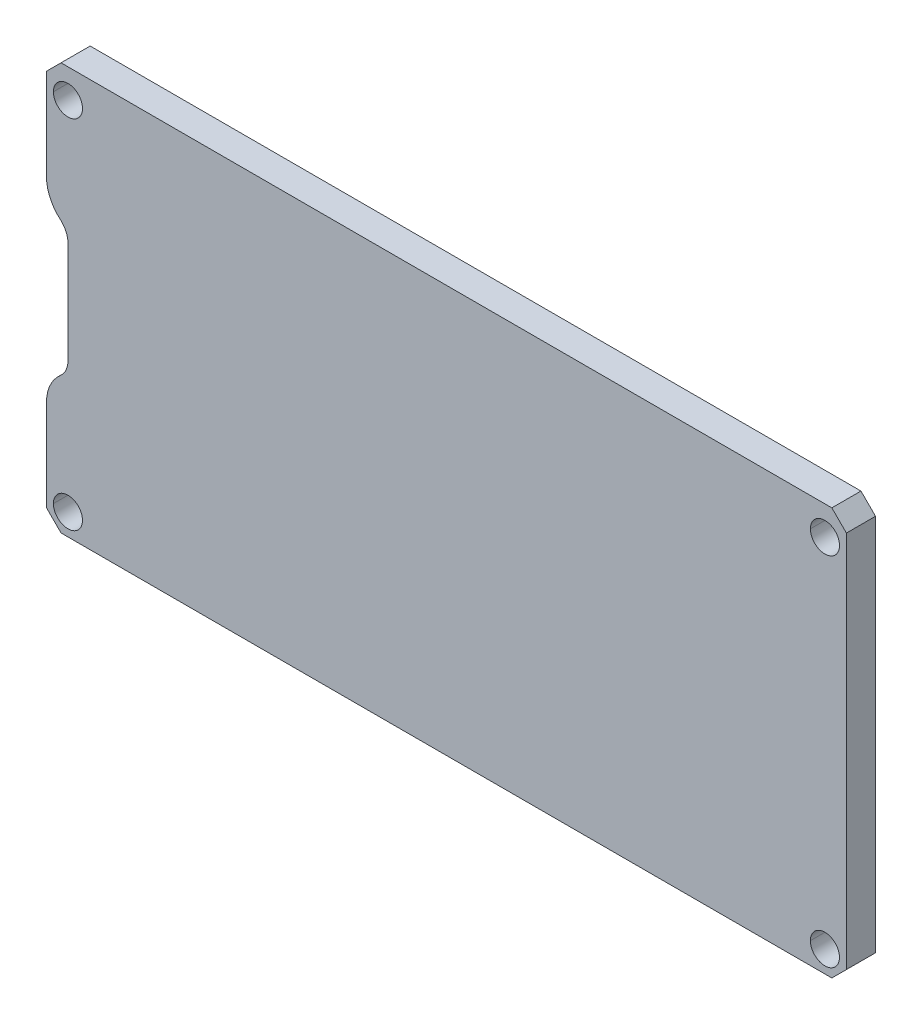
ISO-10303-21;
HEADER;
FILE_DESCRIPTION(('STEP AP214'),'2;1');
FILE_NAME('part.step','',(''),(''),'','','');
FILE_SCHEMA(('AUTOMOTIVE_DESIGN { 1 0 10303 214 1 1 1 1 }'));
ENDSEC;
DATA;
#1=APPLICATION_CONTEXT('core data for automotive mechanical design processes');
#2=APPLICATION_PROTOCOL_DEFINITION('international standard','automotive_design',2000,#1);
#3=PRODUCT_CONTEXT('',#1,'mechanical');
#4=PRODUCT('Part','Part','',(#3));
#5=PRODUCT_RELATED_PRODUCT_CATEGORY('part','',(#4));
#6=PRODUCT_DEFINITION_FORMATION('','',#4);
#7=PRODUCT_DEFINITION_CONTEXT('part definition',#1,'design');
#8=PRODUCT_DEFINITION('design','',#6,#7);
#9=PRODUCT_DEFINITION_SHAPE('','',#8);
#10=(LENGTH_UNIT() NAMED_UNIT(*) SI_UNIT(.MILLI.,.METRE.));
#11=(NAMED_UNIT(*) PLANE_ANGLE_UNIT() SI_UNIT($,.RADIAN.));
#12=(NAMED_UNIT(*) SI_UNIT($,.STERADIAN.) SOLID_ANGLE_UNIT());
#13=UNCERTAINTY_MEASURE_WITH_UNIT(LENGTH_MEASURE(1.E-05),#10,'distance_accuracy_value','');
#14=(GEOMETRIC_REPRESENTATION_CONTEXT(3) GLOBAL_UNCERTAINTY_ASSIGNED_CONTEXT((#13)) GLOBAL_UNIT_ASSIGNED_CONTEXT((#10,
#11,#12)) REPRESENTATION_CONTEXT('',''));
#15=CARTESIAN_POINT('',(0.,0.,0.));
#16=DIRECTION('',(0.,0.,1.));
#17=DIRECTION('',(1.,0.,0.));
#18=AXIS2_PLACEMENT_3D('',#15,#16,#17);
#19=CARTESIAN_POINT('',(26.0000003874302,12.0000001788139,0.));
#20=DIRECTION('',(0.,0.,1.));
#21=DIRECTION('',(1.,0.,0.));
#22=AXIS2_PLACEMENT_3D('',#19,#20,#21);
#23=CYLINDRICAL_SURFACE('',#22,1.00000001490116);
#24=DIRECTION('',(0.,0.,1.));
#25=VECTOR('',#24,1.);
#26=CARTESIAN_POINT('',(25.000000372529,12.0000001788139,0.));
#27=LINE('',#26,#25);
#28=CARTESIAN_POINT('',(25.000000372529,12.0000001788139,0.));
#29=VERTEX_POINT('',#28);
#30=CARTESIAN_POINT('',(25.000000372529,12.0000001788139,2.));
#31=VERTEX_POINT('',#30);
#32=EDGE_CURVE('E296',#29,#31,#27,.T.);
#33=ORIENTED_EDGE('',*,*,#32,.F.);
#34=CARTESIAN_POINT('',(26.0000003874302,12.0000001788139,0.));
#35=DIRECTION('',(0.,0.,-1.));
#36=DIRECTION('',(1.,0.,0.));
#37=AXIS2_PLACEMENT_3D('',#34,#35,#36);
#38=CIRCLE('',#37,1.00000001490116);
#39=CARTESIAN_POINT('',(27.0000004023314,12.0000001788139,0.));
#40=VERTEX_POINT('',#39);
#41=EDGE_CURVE('E388',#29,#40,#38,.T.);
#42=ORIENTED_EDGE('',*,*,#41,.T.);
#43=DIRECTION('',(0.,0.,1.));
#44=VECTOR('',#43,1.);
#45=CARTESIAN_POINT('',(27.0000004023314,12.0000001788139,0.));
#46=LINE('',#45,#44);
#47=CARTESIAN_POINT('',(27.0000004023314,12.0000001788139,2.));
#48=VERTEX_POINT('',#47);
#49=EDGE_CURVE('E295',#40,#48,#46,.T.);
#50=ORIENTED_EDGE('',*,*,#49,.T.);
#51=CARTESIAN_POINT('',(26.0000003874302,12.0000001788139,2.));
#52=DIRECTION('',(0.,0.,-1.));
#53=DIRECTION('',(1.,0.,0.));
#54=AXIS2_PLACEMENT_3D('',#51,#52,#53);
#55=CIRCLE('',#54,1.00000001490116);
#56=EDGE_CURVE('E318',#31,#48,#55,.T.);
#57=ORIENTED_EDGE('',*,*,#56,.F.);
#58=EDGE_LOOP('',(#33,#42,#50,#57));
#59=FACE_BOUND('',#58,.T.);
#60=ADVANCED_FACE('F16',(#59),#23,.F.);
#61=CARTESIAN_POINT('',(26.0000003874302,-12.4999998211861,0.));
#62=DIRECTION('',(0.,0.,1.));
#63=DIRECTION('',(1.,0.,0.));
#64=AXIS2_PLACEMENT_3D('',#61,#62,#63);
#65=CYLINDRICAL_SURFACE('',#64,1.00000001490116);
#66=DIRECTION('',(0.,0.,1.));
#67=VECTOR('',#66,1.);
#68=CARTESIAN_POINT('',(25.000000372529,-12.4999998211861,0.));
#69=LINE('',#68,#67);
#70=CARTESIAN_POINT('',(25.000000372529,-12.4999998211861,0.));
#71=VERTEX_POINT('',#70);
#72=CARTESIAN_POINT('',(25.000000372529,-12.4999998211861,2.));
#73=VERTEX_POINT('',#72);
#74=EDGE_CURVE('E369',#71,#73,#69,.T.);
#75=ORIENTED_EDGE('',*,*,#74,.F.);
#76=CARTESIAN_POINT('',(26.0000003874302,-12.4999998211861,0.));
#77=DIRECTION('',(0.,0.,-1.));
#78=DIRECTION('',(1.,0.,0.));
#79=AXIS2_PLACEMENT_3D('',#76,#77,#78);
#80=CIRCLE('',#79,1.00000001490116);
#81=CARTESIAN_POINT('',(27.0000004023314,-12.4999998211861,0.));
#82=VERTEX_POINT('',#81);
#83=EDGE_CURVE('E307',#71,#82,#80,.T.);
#84=ORIENTED_EDGE('',*,*,#83,.T.);
#85=DIRECTION('',(0.,0.,1.));
#86=VECTOR('',#85,1.);
#87=CARTESIAN_POINT('',(27.0000004023314,-12.4999998211861,0.));
#88=LINE('',#87,#86);
#89=CARTESIAN_POINT('',(27.0000004023314,-12.4999998211861,2.));
#90=VERTEX_POINT('',#89);
#91=EDGE_CURVE('E259',#82,#90,#88,.T.);
#92=ORIENTED_EDGE('',*,*,#91,.T.);
#93=CARTESIAN_POINT('',(26.0000003874302,-12.4999998211861,2.));
#94=DIRECTION('',(0.,0.,-1.));
#95=DIRECTION('',(1.,0.,0.));
#96=AXIS2_PLACEMENT_3D('',#93,#94,#95);
#97=CIRCLE('',#96,1.00000001490116);
#98=EDGE_CURVE('E314',#73,#90,#97,.T.);
#99=ORIENTED_EDGE('',*,*,#98,.F.);
#100=EDGE_LOOP('',(#75,#84,#92,#99));
#101=FACE_BOUND('',#100,.T.);
#102=ADVANCED_FACE('F660',(#101),#65,.F.);
#103=CARTESIAN_POINT('',(-26.0000003874302,12.0000001788139,0.));
#104=DIRECTION('',(0.,0.,1.));
#105=DIRECTION('',(1.,0.,0.));
#106=AXIS2_PLACEMENT_3D('',#103,#104,#105);
#107=CYLINDRICAL_SURFACE('',#106,1.00000001490116);
#108=DIRECTION('',(0.,0.,1.));
#109=VECTOR('',#108,1.);
#110=CARTESIAN_POINT('',(-27.0000004023314,12.0000001788139,0.));
#111=LINE('',#110,#109);
#112=CARTESIAN_POINT('',(-27.0000004023314,12.0000001788139,0.));
#113=VERTEX_POINT('',#112);
#114=CARTESIAN_POINT('',(-27.0000004023314,12.0000001788139,2.));
#115=VERTEX_POINT('',#114);
#116=EDGE_CURVE('E254',#113,#115,#111,.T.);
#117=ORIENTED_EDGE('',*,*,#116,.F.);
#118=CARTESIAN_POINT('',(-26.0000003874302,12.0000001788139,0.));
#119=DIRECTION('',(0.,0.,-1.));
#120=DIRECTION('',(1.,0.,0.));
#121=AXIS2_PLACEMENT_3D('',#118,#119,#120);
#122=CIRCLE('',#121,1.00000001490116);
#123=CARTESIAN_POINT('',(-25.000000372529,12.0000001788139,0.));
#124=VERTEX_POINT('',#123);
#125=EDGE_CURVE('E228',#113,#124,#122,.T.);
#126=ORIENTED_EDGE('',*,*,#125,.T.);
#127=DIRECTION('',(0.,0.,1.));
#128=VECTOR('',#127,1.);
#129=CARTESIAN_POINT('',(-25.000000372529,12.0000001788139,0.));
#130=LINE('',#129,#128);
#131=CARTESIAN_POINT('',(-25.000000372529,12.0000001788139,2.));
#132=VERTEX_POINT('',#131);
#133=EDGE_CURVE('E242',#124,#132,#130,.T.);
#134=ORIENTED_EDGE('',*,*,#133,.T.);
#135=CARTESIAN_POINT('',(-26.0000003874302,12.0000001788139,2.));
#136=DIRECTION('',(0.,0.,-1.));
#137=DIRECTION('',(1.,0.,0.));
#138=AXIS2_PLACEMENT_3D('',#135,#136,#137);
#139=CIRCLE('',#138,1.00000001490116);
#140=EDGE_CURVE('E317',#115,#132,#139,.T.);
#141=ORIENTED_EDGE('',*,*,#140,.F.);
#142=EDGE_LOOP('',(#117,#126,#134,#141));
#143=FACE_BOUND('',#142,.T.);
#144=ADVANCED_FACE('F464',(#143),#107,.F.);
#145=CARTESIAN_POINT('',(-26.0000003874302,-12.4999998211861,0.));
#146=DIRECTION('',(0.,0.,1.));
#147=DIRECTION('',(1.,0.,0.));
#148=AXIS2_PLACEMENT_3D('',#145,#146,#147);
#149=CYLINDRICAL_SURFACE('',#148,1.00000001490116);
#150=DIRECTION('',(0.,0.,1.));
#151=VECTOR('',#150,1.);
#152=CARTESIAN_POINT('',(-27.0000004023314,-12.4999998211861,0.));
#153=LINE('',#152,#151);
#154=CARTESIAN_POINT('',(-27.0000004023314,-12.4999998211861,0.));
#155=VERTEX_POINT('',#154);
#156=CARTESIAN_POINT('',(-27.0000004023314,-12.4999998211861,2.));
#157=VERTEX_POINT('',#156);
#158=EDGE_CURVE('E231',#155,#157,#153,.T.);
#159=ORIENTED_EDGE('',*,*,#158,.F.);
#160=CARTESIAN_POINT('',(-26.0000003874302,-12.4999998211861,0.));
#161=DIRECTION('',(0.,0.,-1.));
#162=DIRECTION('',(1.,0.,0.));
#163=AXIS2_PLACEMENT_3D('',#160,#161,#162);
#164=CIRCLE('',#163,1.00000001490116);
#165=CARTESIAN_POINT('',(-25.000000372529,-12.4999998211861,0.));
#166=VERTEX_POINT('',#165);
#167=EDGE_CURVE('E217',#155,#166,#164,.T.);
#168=ORIENTED_EDGE('',*,*,#167,.T.);
#169=DIRECTION('',(0.,0.,1.));
#170=VECTOR('',#169,1.);
#171=CARTESIAN_POINT('',(-25.000000372529,-12.4999998211861,0.));
#172=LINE('',#171,#170);
#173=CARTESIAN_POINT('',(-25.000000372529,-12.4999998211861,2.));
#174=VERTEX_POINT('',#173);
#175=EDGE_CURVE('E240',#166,#174,#172,.T.);
#176=ORIENTED_EDGE('',*,*,#175,.T.);
#177=CARTESIAN_POINT('',(-26.0000003874302,-12.4999998211861,2.));
#178=DIRECTION('',(0.,0.,-1.));
#179=DIRECTION('',(1.,0.,0.));
#180=AXIS2_PLACEMENT_3D('',#177,#178,#179);
#181=CIRCLE('',#180,1.00000001490116);
#182=EDGE_CURVE('E20',#157,#174,#181,.T.);
#183=ORIENTED_EDGE('',*,*,#182,.F.);
#184=EDGE_LOOP('',(#159,#168,#176,#183));
#185=FACE_BOUND('',#184,.T.);
#186=ADVANCED_FACE('F232',(#185),#149,.F.);
#187=CARTESIAN_POINT('',(-27.5000003874302,3.50000007450581,0.));
#188=DIRECTION('',(0.,0.,1.));
#189=DIRECTION('',(1.,0.,0.));
#190=AXIS2_PLACEMENT_3D('',#187,#188,#189);
#191=CYLINDRICAL_SURFACE('',#190,1.5);
#192=CARTESIAN_POINT('',(-27.5000003874302,3.50000007450581,0.));
#193=DIRECTION('',(0.,0.,1.));
#194=DIRECTION('',(1.,0.,0.));
#195=AXIS2_PLACEMENT_3D('',#192,#193,#194);
#196=CIRCLE('',#195,1.5);
#197=CARTESIAN_POINT('',(-26.0000003874302,3.5000000745058,0.));
#198=VERTEX_POINT('',#197);
#199=CARTESIAN_POINT('',(-26.5205884859842,4.63611288902117,0.));
#200=VERTEX_POINT('',#199);
#201=EDGE_CURVE('E325',#198,#200,#196,.T.);
#202=ORIENTED_EDGE('',*,*,#201,.F.);
#203=DIRECTION('',(0.,0.,1.));
#204=VECTOR('',#203,1.);
#205=CARTESIAN_POINT('',(-26.0000003874302,3.5000000745058,0.));
#206=LINE('',#205,#204);
#207=CARTESIAN_POINT('',(-26.0000003874302,3.5000000745058,2.));
#208=VERTEX_POINT('',#207);
#209=EDGE_CURVE('E335',#198,#208,#206,.T.);
#210=ORIENTED_EDGE('',*,*,#209,.T.);
#211=CARTESIAN_POINT('',(-27.5000003874302,3.50000007450581,2.));
#212=DIRECTION('',(0.,0.,-1.));
#213=DIRECTION('',(1.,0.,0.));
#214=AXIS2_PLACEMENT_3D('',#211,#212,#213);
#215=CIRCLE('',#214,1.5);
#216=CARTESIAN_POINT('',(-26.5205884859842,4.63611288902117,2.));
#217=VERTEX_POINT('',#216);
#218=EDGE_CURVE('E339',#217,#208,#215,.T.);
#219=ORIENTED_EDGE('',*,*,#218,.F.);
#220=DIRECTION('',(0.,0.,1.));
#221=VECTOR('',#220,1.);
#222=CARTESIAN_POINT('',(-26.5205884859842,4.63611288902117,0.));
#223=LINE('',#222,#221);
#224=EDGE_CURVE('E11',#200,#217,#223,.T.);
#225=ORIENTED_EDGE('',*,*,#224,.F.);
#226=EDGE_LOOP('',(#202,#210,#219,#225));
#227=FACE_BOUND('',#226,.T.);
#228=ADVANCED_FACE('F18',(#227),#191,.F.);
#229=CARTESIAN_POINT('',(-24.725,6.71898638229935,0.));
#230=DIRECTION('',(0.,0.,1.));
#231=DIRECTION('',(-1.,0.,0.));
#232=AXIS2_PLACEMENT_3D('',#229,#230,#231);
#233=CYLINDRICAL_SURFACE('',#232,2.75);
#234=CARTESIAN_POINT('',(-24.725,6.71898638229935,0.));
#235=DIRECTION('',(0.,0.,1.));
#236=DIRECTION('',(-1.,0.,0.));
#237=AXIS2_PLACEMENT_3D('',#234,#235,#236);
#238=CIRCLE('',#237,2.75);
#239=CARTESIAN_POINT('',(-27.475,6.71898638229935,0.));
#240=VERTEX_POINT('',#239);
#241=EDGE_CURVE('E271',#240,#200,#238,.T.);
#242=ORIENTED_EDGE('',*,*,#241,.T.);
#243=ORIENTED_EDGE('',*,*,#224,.T.);
#244=CARTESIAN_POINT('',(-24.725,6.71898638229935,2.));
#245=DIRECTION('',(0.,0.,1.));
#246=DIRECTION('',(-1.,0.,0.));
#247=AXIS2_PLACEMENT_3D('',#244,#245,#246);
#248=CIRCLE('',#247,2.75);
#249=CARTESIAN_POINT('',(-27.475,6.71898638229935,2.));
#250=VERTEX_POINT('',#249);
#251=EDGE_CURVE('E342',#250,#217,#248,.T.);
#252=ORIENTED_EDGE('',*,*,#251,.F.);
#253=DIRECTION('',(0.,0.,1.));
#254=VECTOR('',#253,1.);
#255=CARTESIAN_POINT('',(-27.475,6.71898638229935,0.));
#256=LINE('',#255,#254);
#257=EDGE_CURVE('E27',#240,#250,#256,.T.);
#258=ORIENTED_EDGE('',*,*,#257,.F.);
#259=EDGE_LOOP('',(#242,#243,#252,#258));
#260=FACE_BOUND('',#259,.T.);
#261=ADVANCED_FACE('F434',(#260),#233,.T.);
#262=CARTESIAN_POINT('',(-27.475,12.985,0.));
#263=DIRECTION('',(-1.,0.,0.));
#264=DIRECTION('',(0.,0.,1.));
#265=AXIS2_PLACEMENT_3D('',#262,#263,#264);
#266=PLANE('',#265);
#267=DIRECTION('',(0.,-1.,0.));
#268=VECTOR('',#267,1.);
#269=CARTESIAN_POINT('',(-27.475,12.985,0.));
#270=LINE('',#269,#268);
#271=CARTESIAN_POINT('',(-27.475,12.985,0.));
#272=VERTEX_POINT('',#271);
#273=EDGE_CURVE('E266',#272,#240,#270,.T.);
#274=ORIENTED_EDGE('',*,*,#273,.T.);
#275=ORIENTED_EDGE('',*,*,#257,.T.);
#276=DIRECTION('',(0.,-1.,0.));
#277=VECTOR('',#276,1.);
#278=CARTESIAN_POINT('',(-27.475,12.985,2.));
#279=LINE('',#278,#277);
#280=CARTESIAN_POINT('',(-27.475,12.985,2.));
#281=VERTEX_POINT('',#280);
#282=EDGE_CURVE('E312',#281,#250,#279,.T.);
#283=ORIENTED_EDGE('',*,*,#282,.F.);
#284=DIRECTION('',(0.,0.,1.));
#285=VECTOR('',#284,1.);
#286=CARTESIAN_POINT('',(-27.475,12.985,0.));
#287=LINE('',#286,#285);
#288=EDGE_CURVE('E278',#272,#281,#287,.T.);
#289=ORIENTED_EDGE('',*,*,#288,.F.);
#290=EDGE_LOOP('',(#274,#275,#283,#289));
#291=FACE_BOUND('',#290,.T.);
#292=ADVANCED_FACE('F712',(#291),#266,.T.);
#293=CARTESIAN_POINT('',(-26.475,13.985,0.));
#294=DIRECTION('',(-0.707106781186548,0.707106781186548,0.));
#295=DIRECTION('',(0.,0.,1.));
#296=AXIS2_PLACEMENT_3D('',#293,#294,#295);
#297=PLANE('',#296);
#298=DIRECTION('',(-0.707106781186548,-0.707106781186548,0.));
#299=VECTOR('',#298,1.);
#300=CARTESIAN_POINT('',(-26.475,13.985,0.));
#301=LINE('',#300,#299);
#302=CARTESIAN_POINT('',(-26.475,13.985,0.));
#303=VERTEX_POINT('',#302);
#304=EDGE_CURVE('E270',#303,#272,#301,.T.);
#305=ORIENTED_EDGE('',*,*,#304,.T.);
#306=ORIENTED_EDGE('',*,*,#288,.T.);
#307=DIRECTION('',(-0.707106781186548,-0.707106781186548,0.));
#308=VECTOR('',#307,1.);
#309=CARTESIAN_POINT('',(-26.475,13.985,2.));
#310=LINE('',#309,#308);
#311=CARTESIAN_POINT('',(-26.475,13.985,2.));
#312=VERTEX_POINT('',#311);
#313=EDGE_CURVE('E308',#312,#281,#310,.T.);
#314=ORIENTED_EDGE('',*,*,#313,.F.);
#315=DIRECTION('',(0.,0.,1.));
#316=VECTOR('',#315,1.);
#317=CARTESIAN_POINT('',(-26.475,13.985,0.));
#318=LINE('',#317,#316);
#319=EDGE_CURVE('E161',#303,#312,#318,.T.);
#320=ORIENTED_EDGE('',*,*,#319,.F.);
#321=EDGE_LOOP('',(#305,#306,#314,#320));
#322=FACE_BOUND('',#321,.T.);
#323=ADVANCED_FACE('F716',(#322),#297,.T.);
#324=CARTESIAN_POINT('',(26.475,13.985,0.));
#325=DIRECTION('',(0.,1.,0.));
#326=DIRECTION('',(1.,0.,0.));
#327=AXIS2_PLACEMENT_3D('',#324,#325,#326);
#328=PLANE('',#327);
#329=DIRECTION('',(-1.,0.,0.));
#330=VECTOR('',#329,1.);
#331=CARTESIAN_POINT('',(26.475,13.985,0.));
#332=LINE('',#331,#330);
#333=CARTESIAN_POINT('',(26.475,13.985,0.));
#334=VERTEX_POINT('',#333);
#335=EDGE_CURVE('E297',#334,#303,#332,.T.);
#336=ORIENTED_EDGE('',*,*,#335,.T.);
#337=ORIENTED_EDGE('',*,*,#319,.T.);
#338=DIRECTION('',(-1.,0.,0.));
#339=VECTOR('',#338,1.);
#340=CARTESIAN_POINT('',(26.475,13.985,2.));
#341=LINE('',#340,#339);
#342=CARTESIAN_POINT('',(26.475,13.985,2.));
#343=VERTEX_POINT('',#342);
#344=EDGE_CURVE('E313',#343,#312,#341,.T.);
#345=ORIENTED_EDGE('',*,*,#344,.F.);
#346=DIRECTION('',(0.,0.,1.));
#347=VECTOR('',#346,1.);
#348=CARTESIAN_POINT('',(26.475,13.985,0.));
#349=LINE('',#348,#347);
#350=EDGE_CURVE('E149',#334,#343,#349,.T.);
#351=ORIENTED_EDGE('',*,*,#350,.F.);
#352=EDGE_LOOP('',(#336,#337,#345,#351));
#353=FACE_BOUND('',#352,.T.);
#354=ADVANCED_FACE('F707',(#353),#328,.T.);
#355=CARTESIAN_POINT('',(27.475,12.985,0.));
#356=DIRECTION('',(0.707106781186548,0.707106781186548,0.));
#357=DIRECTION('',(0.,0.,-1.));
#358=AXIS2_PLACEMENT_3D('',#355,#356,#357);
#359=PLANE('',#358);
#360=DIRECTION('',(0.707106781186548,-0.707106781186548,0.));
#361=VECTOR('',#360,1.);
#362=CARTESIAN_POINT('',(26.475,13.985,0.));
#363=LINE('',#362,#361);
#364=CARTESIAN_POINT('',(27.475,12.985,0.));
#365=VERTEX_POINT('',#364);
#366=EDGE_CURVE('E299',#334,#365,#363,.T.);
#367=ORIENTED_EDGE('',*,*,#366,.F.);
#368=ORIENTED_EDGE('',*,*,#350,.T.);
#369=DIRECTION('',(-0.707106781186548,0.707106781186548,0.));
#370=VECTOR('',#369,1.);
#371=CARTESIAN_POINT('',(26.475,13.985,2.));
#372=LINE('',#371,#370);
#373=CARTESIAN_POINT('',(27.475,12.985,2.));
#374=VERTEX_POINT('',#373);
#375=EDGE_CURVE('E338',#374,#343,#372,.T.);
#376=ORIENTED_EDGE('',*,*,#375,.F.);
#377=DIRECTION('',(0.,0.,1.));
#378=VECTOR('',#377,1.);
#379=CARTESIAN_POINT('',(27.475,12.985,0.));
#380=LINE('',#379,#378);
#381=EDGE_CURVE('E322',#365,#374,#380,.T.);
#382=ORIENTED_EDGE('',*,*,#381,.F.);
#383=EDGE_LOOP('',(#367,#368,#376,#382));
#384=FACE_BOUND('',#383,.T.);
#385=ADVANCED_FACE('F702',(#384),#359,.T.);
#386=CARTESIAN_POINT('',(27.475,-12.985,0.));
#387=DIRECTION('',(1.,0.,0.));
#388=DIRECTION('',(0.,1.,0.));
#389=AXIS2_PLACEMENT_3D('',#386,#387,#388);
#390=PLANE('',#389);
#391=DIRECTION('',(0.,1.,0.));
#392=VECTOR('',#391,1.);
#393=CARTESIAN_POINT('',(27.475,-12.985,0.));
#394=LINE('',#393,#392);
#395=CARTESIAN_POINT('',(27.475,-12.985,0.));
#396=VERTEX_POINT('',#395);
#397=EDGE_CURVE('E394',#396,#365,#394,.T.);
#398=ORIENTED_EDGE('',*,*,#397,.T.);
#399=ORIENTED_EDGE('',*,*,#381,.T.);
#400=DIRECTION('',(0.,1.,0.));
#401=VECTOR('',#400,1.);
#402=CARTESIAN_POINT('',(27.475,-12.985,2.));
#403=LINE('',#402,#401);
#404=CARTESIAN_POINT('',(27.475,-12.985,2.));
#405=VERTEX_POINT('',#404);
#406=EDGE_CURVE('E276',#405,#374,#403,.T.);
#407=ORIENTED_EDGE('',*,*,#406,.F.);
#408=DIRECTION('',(0.,0.,1.));
#409=VECTOR('',#408,1.);
#410=CARTESIAN_POINT('',(27.475,-12.985,0.));
#411=LINE('',#410,#409);
#412=EDGE_CURVE('E319',#396,#405,#411,.T.);
#413=ORIENTED_EDGE('',*,*,#412,.F.);
#414=EDGE_LOOP('',(#398,#399,#407,#413));
#415=FACE_BOUND('',#414,.T.);
#416=ADVANCED_FACE('F706',(#415),#390,.T.);
#417=CARTESIAN_POINT('',(26.475,-13.985,0.));
#418=DIRECTION('',(0.707106781186548,-0.707106781186548,0.));
#419=DIRECTION('',(0.,0.,-1.));
#420=AXIS2_PLACEMENT_3D('',#417,#418,#419);
#421=PLANE('',#420);
#422=DIRECTION('',(0.707106781186548,0.707106781186548,0.));
#423=VECTOR('',#422,1.);
#424=CARTESIAN_POINT('',(26.475,-13.985,0.));
#425=LINE('',#424,#423);
#426=CARTESIAN_POINT('',(26.475,-13.985,0.));
#427=VERTEX_POINT('',#426);
#428=EDGE_CURVE('E382',#427,#396,#425,.T.);
#429=ORIENTED_EDGE('',*,*,#428,.T.);
#430=ORIENTED_EDGE('',*,*,#412,.T.);
#431=DIRECTION('',(0.707106781186548,0.707106781186548,0.));
#432=VECTOR('',#431,1.);
#433=CARTESIAN_POINT('',(26.475,-13.985,2.));
#434=LINE('',#433,#432);
#435=CARTESIAN_POINT('',(26.475,-13.985,2.));
#436=VERTEX_POINT('',#435);
#437=EDGE_CURVE('E272',#436,#405,#434,.T.);
#438=ORIENTED_EDGE('',*,*,#437,.F.);
#439=DIRECTION('',(0.,0.,1.));
#440=VECTOR('',#439,1.);
#441=CARTESIAN_POINT('',(26.475,-13.985,0.));
#442=LINE('',#441,#440);
#443=EDGE_CURVE('E289',#427,#436,#442,.T.);
#444=ORIENTED_EDGE('',*,*,#443,.F.);
#445=EDGE_LOOP('',(#429,#430,#438,#444));
#446=FACE_BOUND('',#445,.T.);
#447=ADVANCED_FACE('F788',(#446),#421,.T.);
#448=CARTESIAN_POINT('',(-26.475,-13.985,0.));
#449=DIRECTION('',(0.,-1.,0.));
#450=DIRECTION('',(0.,0.,-1.));
#451=AXIS2_PLACEMENT_3D('',#448,#449,#450);
#452=PLANE('',#451);
#453=DIRECTION('',(1.,0.,0.));
#454=VECTOR('',#453,1.);
#455=CARTESIAN_POINT('',(-26.475,-13.985,0.));
#456=LINE('',#455,#454);
#457=CARTESIAN_POINT('',(-26.475,-13.985,0.));
#458=VERTEX_POINT('',#457);
#459=EDGE_CURVE('E377',#458,#427,#456,.T.);
#460=ORIENTED_EDGE('',*,*,#459,.T.);
#461=ORIENTED_EDGE('',*,*,#443,.T.);
#462=DIRECTION('',(1.,0.,0.));
#463=VECTOR('',#462,1.);
#464=CARTESIAN_POINT('',(-26.475,-13.985,2.));
#465=LINE('',#464,#463);
#466=CARTESIAN_POINT('',(-26.475,-13.985,2.));
#467=VERTEX_POINT('',#466);
#468=EDGE_CURVE('E277',#467,#436,#465,.T.);
#469=ORIENTED_EDGE('',*,*,#468,.F.);
#470=DIRECTION('',(0.,0.,1.));
#471=VECTOR('',#470,1.);
#472=CARTESIAN_POINT('',(-26.475,-13.985,0.));
#473=LINE('',#472,#471);
#474=EDGE_CURVE('E286',#458,#467,#473,.T.);
#475=ORIENTED_EDGE('',*,*,#474,.F.);
#476=EDGE_LOOP('',(#460,#461,#469,#475));
#477=FACE_BOUND('',#476,.T.);
#478=ADVANCED_FACE('F696',(#477),#452,.T.);
#479=CARTESIAN_POINT('',(-27.475,-12.985,0.));
#480=DIRECTION('',(-0.707106781186548,-0.707106781186548,0.));
#481=DIRECTION('',(-0.707106781186548,0.707106781186548,0.));
#482=AXIS2_PLACEMENT_3D('',#479,#480,#481);
#483=PLANE('',#482);
#484=DIRECTION('',(-0.707106781186548,0.707106781186548,0.));
#485=VECTOR('',#484,1.);
#486=CARTESIAN_POINT('',(-26.475,-13.985,0.));
#487=LINE('',#486,#485);
#488=CARTESIAN_POINT('',(-27.475,-12.985,0.));
#489=VERTEX_POINT('',#488);
#490=EDGE_CURVE('E381',#458,#489,#487,.T.);
#491=ORIENTED_EDGE('',*,*,#490,.F.);
#492=ORIENTED_EDGE('',*,*,#474,.T.);
#493=DIRECTION('',(0.707106781186548,-0.707106781186548,0.));
#494=VECTOR('',#493,1.);
#495=CARTESIAN_POINT('',(-26.475,-13.985,2.));
#496=LINE('',#495,#494);
#497=CARTESIAN_POINT('',(-27.475,-12.985,2.));
#498=VERTEX_POINT('',#497);
#499=EDGE_CURVE('E407',#498,#467,#496,.T.);
#500=ORIENTED_EDGE('',*,*,#499,.F.);
#501=DIRECTION('',(0.,0.,1.));
#502=VECTOR('',#501,1.);
#503=CARTESIAN_POINT('',(-27.475,-12.985,0.));
#504=LINE('',#503,#502);
#505=EDGE_CURVE('E290',#489,#498,#504,.T.);
#506=ORIENTED_EDGE('',*,*,#505,.F.);
#507=EDGE_LOOP('',(#491,#492,#500,#506));
#508=FACE_BOUND('',#507,.T.);
#509=ADVANCED_FACE('F670',(#508),#483,.T.);
#510=CARTESIAN_POINT('',(-27.475,-6.71898638229935,0.));
#511=DIRECTION('',(-1.,0.,0.));
#512=DIRECTION('',(0.,0.,1.));
#513=AXIS2_PLACEMENT_3D('',#510,#511,#512);
#514=PLANE('',#513);
#515=DIRECTION('',(0.,-1.,0.));
#516=VECTOR('',#515,1.);
#517=CARTESIAN_POINT('',(-27.475,-6.71898638229935,0.));
#518=LINE('',#517,#516);
#519=CARTESIAN_POINT('',(-27.475,-6.71898638229935,0.));
#520=VERTEX_POINT('',#519);
#521=EDGE_CURVE('E265',#520,#489,#518,.T.);
#522=ORIENTED_EDGE('',*,*,#521,.T.);
#523=ORIENTED_EDGE('',*,*,#505,.T.);
#524=DIRECTION('',(0.,-1.,0.));
#525=VECTOR('',#524,1.);
#526=CARTESIAN_POINT('',(-27.475,-6.71898638229935,2.));
#527=LINE('',#526,#525);
#528=CARTESIAN_POINT('',(-27.475,-6.71898638229935,2.));
#529=VERTEX_POINT('',#528);
#530=EDGE_CURVE('E416',#529,#498,#527,.T.);
#531=ORIENTED_EDGE('',*,*,#530,.F.);
#532=DIRECTION('',(0.,0.,1.));
#533=VECTOR('',#532,1.);
#534=CARTESIAN_POINT('',(-27.475,-6.71898638229935,0.));
#535=LINE('',#534,#533);
#536=EDGE_CURVE('E301',#520,#529,#535,.T.);
#537=ORIENTED_EDGE('',*,*,#536,.F.);
#538=EDGE_LOOP('',(#522,#523,#531,#537));
#539=FACE_BOUND('',#538,.T.);
#540=ADVANCED_FACE('F665',(#539),#514,.T.);
#541=CARTESIAN_POINT('',(-24.725,-6.71898638229934,0.));
#542=DIRECTION('',(0.,0.,1.));
#543=DIRECTION('',(-0.652941267630629,0.757408543010248,0.));
#544=AXIS2_PLACEMENT_3D('',#541,#542,#543);
#545=CYLINDRICAL_SURFACE('',#544,2.75);
#546=CARTESIAN_POINT('',(-24.725,-6.71898638229934,0.));
#547=DIRECTION('',(0.,0.,1.));
#548=DIRECTION('',(-0.652941267630629,0.757408543010248,0.));
#549=AXIS2_PLACEMENT_3D('',#546,#547,#548);
#550=CIRCLE('',#549,2.75);
#551=CARTESIAN_POINT('',(-26.5205884859842,-4.63611288902117,0.));
#552=VERTEX_POINT('',#551);
#553=EDGE_CURVE('E260',#552,#520,#550,.T.);
#554=ORIENTED_EDGE('',*,*,#553,.T.);
#555=ORIENTED_EDGE('',*,*,#536,.T.);
#556=CARTESIAN_POINT('',(-24.725,-6.71898638229934,2.));
#557=DIRECTION('',(0.,0.,1.));
#558=DIRECTION('',(-0.652941267630629,0.757408543010248,0.));
#559=AXIS2_PLACEMENT_3D('',#556,#557,#558);
#560=CIRCLE('',#559,2.75);
#561=CARTESIAN_POINT('',(-26.5205884859842,-4.63611288902118,2.));
#562=VERTEX_POINT('',#561);
#563=EDGE_CURVE('E285',#562,#529,#560,.T.);
#564=ORIENTED_EDGE('',*,*,#563,.F.);
#565=DIRECTION('',(0.,0.,1.));
#566=VECTOR('',#565,1.);
#567=CARTESIAN_POINT('',(-26.5205884859842,-4.63611288902117,0.));
#568=LINE('',#567,#566);
#569=EDGE_CURVE('E304',#552,#562,#568,.T.);
#570=ORIENTED_EDGE('',*,*,#569,.F.);
#571=EDGE_LOOP('',(#554,#555,#564,#570));
#572=FACE_BOUND('',#571,.T.);
#573=ADVANCED_FACE('F669',(#572),#545,.T.);
#574=CARTESIAN_POINT('',(-27.5000003874302,-3.50000007450581,0.));
#575=DIRECTION('',(0.,0.,1.));
#576=DIRECTION('',(0.652941267630632,-0.757408543010246,0.));
#577=AXIS2_PLACEMENT_3D('',#574,#575,#576);
#578=CYLINDRICAL_SURFACE('',#577,1.5);
#579=CARTESIAN_POINT('',(-27.5000003874302,-3.50000007450581,0.));
#580=DIRECTION('',(0.,0.,1.));
#581=DIRECTION('',(0.652941267630632,-0.757408543010246,0.));
#582=AXIS2_PLACEMENT_3D('',#579,#580,#581);
#583=CIRCLE('',#582,1.5);
#584=CARTESIAN_POINT('',(-26.0000003874302,-3.50000007450581,0.));
#585=VERTEX_POINT('',#584);
#586=EDGE_CURVE('E264',#552,#585,#583,.T.);
#587=ORIENTED_EDGE('',*,*,#586,.F.);
#588=ORIENTED_EDGE('',*,*,#569,.T.);
#589=CARTESIAN_POINT('',(-27.5000003874302,-3.50000007450581,2.));
#590=DIRECTION('',(0.,0.,-1.));
#591=DIRECTION('',(0.652941267630632,-0.757408543010246,0.));
#592=AXIS2_PLACEMENT_3D('',#589,#590,#591);
#593=CIRCLE('',#592,1.5);
#594=CARTESIAN_POINT('',(-26.0000003874302,-3.50000007450581,2.));
#595=VERTEX_POINT('',#594);
#596=EDGE_CURVE('E281',#595,#562,#593,.T.);
#597=ORIENTED_EDGE('',*,*,#596,.F.);
#598=DIRECTION('',(0.,0.,1.));
#599=VECTOR('',#598,1.);
#600=CARTESIAN_POINT('',(-26.0000003874302,-3.50000007450581,0.));
#601=LINE('',#600,#599);
#602=EDGE_CURVE('E332',#585,#595,#601,.T.);
#603=ORIENTED_EDGE('',*,*,#602,.F.);
#604=EDGE_LOOP('',(#587,#588,#597,#603));
#605=FACE_BOUND('',#604,.T.);
#606=ADVANCED_FACE('F741',(#605),#578,.F.);
#607=CARTESIAN_POINT('',(-26.0000003874302,3.5000000745058,0.));
#608=DIRECTION('',(-1.,0.,0.));
#609=DIRECTION('',(0.,0.,1.));
#610=AXIS2_PLACEMENT_3D('',#607,#608,#609);
#611=PLANE('',#610);
#612=DIRECTION('',(0.,-1.,0.));
#613=VECTOR('',#612,1.);
#614=CARTESIAN_POINT('',(-26.0000003874302,3.5000000745058,0.));
#615=LINE('',#614,#613);
#616=EDGE_CURVE('E329',#198,#585,#615,.T.);
#617=ORIENTED_EDGE('',*,*,#616,.T.);
#618=ORIENTED_EDGE('',*,*,#602,.T.);
#619=DIRECTION('',(0.,-1.,0.));
#620=VECTOR('',#619,1.);
#621=CARTESIAN_POINT('',(-26.0000003874302,3.5000000745058,2.));
#622=LINE('',#621,#620);
#623=EDGE_CURVE('E227',#208,#595,#622,.T.);
#624=ORIENTED_EDGE('',*,*,#623,.F.);
#625=ORIENTED_EDGE('',*,*,#209,.F.);
#626=EDGE_LOOP('',(#617,#618,#624,#625));
#627=FACE_BOUND('',#626,.T.);
#628=ADVANCED_FACE('F472',(#627),#611,.T.);
#629=CARTESIAN_POINT('',(0.,0.,2.));
#630=DIRECTION('',(0.,0.,1.));
#631=DIRECTION('',(1.,0.,0.));
#632=AXIS2_PLACEMENT_3D('',#629,#630,#631);
#633=PLANE('',#632);
#634=CARTESIAN_POINT('',(-26.0000003874302,-12.4999998211861,2.));
#635=DIRECTION('',(0.,0.,-1.));
#636=DIRECTION('',(1.,0.,0.));
#637=AXIS2_PLACEMENT_3D('',#634,#635,#636);
#638=CIRCLE('',#637,1.00000001490116);
#639=EDGE_CURVE('E237',#174,#157,#638,.T.);
#640=ORIENTED_EDGE('',*,*,#639,.T.);
#641=ORIENTED_EDGE('',*,*,#182,.T.);
#642=EDGE_LOOP('',(#640,#641));
#643=FACE_BOUND('',#642,.T.);
#644=CARTESIAN_POINT('',(-26.0000003874302,12.0000001788139,2.));
#645=DIRECTION('',(0.,0.,-1.));
#646=DIRECTION('',(1.,0.,0.));
#647=AXIS2_PLACEMENT_3D('',#644,#645,#646);
#648=CIRCLE('',#647,1.00000001490116);
#649=EDGE_CURVE('E250',#132,#115,#648,.T.);
#650=ORIENTED_EDGE('',*,*,#649,.T.);
#651=ORIENTED_EDGE('',*,*,#140,.T.);
#652=EDGE_LOOP('',(#650,#651));
#653=FACE_BOUND('',#652,.T.);
#654=CARTESIAN_POINT('',(26.0000003874302,-12.4999998211861,2.));
#655=DIRECTION('',(0.,0.,-1.));
#656=DIRECTION('',(1.,0.,0.));
#657=AXIS2_PLACEMENT_3D('',#654,#655,#656);
#658=CIRCLE('',#657,1.00000001490116);
#659=EDGE_CURVE('E373',#90,#73,#658,.T.);
#660=ORIENTED_EDGE('',*,*,#659,.T.);
#661=ORIENTED_EDGE('',*,*,#98,.T.);
#662=EDGE_LOOP('',(#660,#661));
#663=FACE_BOUND('',#662,.T.);
#664=CARTESIAN_POINT('',(26.0000003874302,12.0000001788139,2.));
#665=DIRECTION('',(0.,0.,-1.));
#666=DIRECTION('',(1.,0.,0.));
#667=AXIS2_PLACEMENT_3D('',#664,#665,#666);
#668=CIRCLE('',#667,1.00000001490116);
#669=EDGE_CURVE('E291',#48,#31,#668,.T.);
#670=ORIENTED_EDGE('',*,*,#669,.T.);
#671=ORIENTED_EDGE('',*,*,#56,.T.);
#672=EDGE_LOOP('',(#670,#671));
#673=FACE_BOUND('',#672,.T.);
#674=ORIENTED_EDGE('',*,*,#623,.T.);
#675=ORIENTED_EDGE('',*,*,#596,.T.);
#676=ORIENTED_EDGE('',*,*,#563,.T.);
#677=ORIENTED_EDGE('',*,*,#530,.T.);
#678=ORIENTED_EDGE('',*,*,#499,.T.);
#679=ORIENTED_EDGE('',*,*,#468,.T.);
#680=ORIENTED_EDGE('',*,*,#437,.T.);
#681=ORIENTED_EDGE('',*,*,#406,.T.);
#682=ORIENTED_EDGE('',*,*,#375,.T.);
#683=ORIENTED_EDGE('',*,*,#344,.T.);
#684=ORIENTED_EDGE('',*,*,#313,.T.);
#685=ORIENTED_EDGE('',*,*,#282,.T.);
#686=ORIENTED_EDGE('',*,*,#251,.T.);
#687=ORIENTED_EDGE('',*,*,#218,.T.);
#688=EDGE_LOOP('',(#674,#675,#676,#677,#678,#679,#680,#681,#682,#683,#684,#685,#686,#687));
#689=FACE_BOUND('',#688,.T.);
#690=ADVANCED_FACE('F469',(#643,#653,#663,#673,#689),#633,.T.);
#691=CARTESIAN_POINT('',(0.,0.,0.));
#692=DIRECTION('',(0.,0.,1.));
#693=DIRECTION('',(1.,0.,0.));
#694=AXIS2_PLACEMENT_3D('',#691,#692,#693);
#695=PLANE('',#694);
#696=CARTESIAN_POINT('',(-26.0000003874302,-12.4999998211861,0.));
#697=DIRECTION('',(0.,0.,-1.));
#698=DIRECTION('',(1.,0.,0.));
#699=AXIS2_PLACEMENT_3D('',#696,#697,#698);
#700=CIRCLE('',#699,1.00000001490116);
#701=EDGE_CURVE('E222',#166,#155,#700,.T.);
#702=ORIENTED_EDGE('',*,*,#701,.F.);
#703=ORIENTED_EDGE('',*,*,#167,.F.);
#704=EDGE_LOOP('',(#702,#703));
#705=FACE_BOUND('',#704,.T.);
#706=CARTESIAN_POINT('',(-26.0000003874302,12.0000001788139,0.));
#707=DIRECTION('',(0.,0.,-1.));
#708=DIRECTION('',(1.,0.,0.));
#709=AXIS2_PLACEMENT_3D('',#706,#707,#708);
#710=CIRCLE('',#709,1.00000001490116);
#711=EDGE_CURVE('E256',#124,#113,#710,.T.);
#712=ORIENTED_EDGE('',*,*,#711,.F.);
#713=ORIENTED_EDGE('',*,*,#125,.F.);
#714=EDGE_LOOP('',(#712,#713));
#715=FACE_BOUND('',#714,.T.);
#716=CARTESIAN_POINT('',(26.0000003874302,-12.4999998211861,0.));
#717=DIRECTION('',(0.,0.,-1.));
#718=DIRECTION('',(1.,0.,0.));
#719=AXIS2_PLACEMENT_3D('',#716,#717,#718);
#720=CIRCLE('',#719,1.00000001490116);
#721=EDGE_CURVE('E365',#82,#71,#720,.T.);
#722=ORIENTED_EDGE('',*,*,#721,.F.);
#723=ORIENTED_EDGE('',*,*,#83,.F.);
#724=EDGE_LOOP('',(#722,#723));
#725=FACE_BOUND('',#724,.T.);
#726=CARTESIAN_POINT('',(26.0000003874302,12.0000001788139,0.));
#727=DIRECTION('',(0.,0.,-1.));
#728=DIRECTION('',(1.,0.,0.));
#729=AXIS2_PLACEMENT_3D('',#726,#727,#728);
#730=CIRCLE('',#729,1.00000001490116);
#731=EDGE_CURVE('E1014',#40,#29,#730,.T.);
#732=ORIENTED_EDGE('',*,*,#731,.F.);
#733=ORIENTED_EDGE('',*,*,#41,.F.);
#734=EDGE_LOOP('',(#732,#733));
#735=FACE_BOUND('',#734,.T.);
#736=ORIENTED_EDGE('',*,*,#616,.F.);
#737=ORIENTED_EDGE('',*,*,#201,.T.);
#738=ORIENTED_EDGE('',*,*,#241,.F.);
#739=ORIENTED_EDGE('',*,*,#273,.F.);
#740=ORIENTED_EDGE('',*,*,#304,.F.);
#741=ORIENTED_EDGE('',*,*,#335,.F.);
#742=ORIENTED_EDGE('',*,*,#366,.T.);
#743=ORIENTED_EDGE('',*,*,#397,.F.);
#744=ORIENTED_EDGE('',*,*,#428,.F.);
#745=ORIENTED_EDGE('',*,*,#459,.F.);
#746=ORIENTED_EDGE('',*,*,#490,.T.);
#747=ORIENTED_EDGE('',*,*,#521,.F.);
#748=ORIENTED_EDGE('',*,*,#553,.F.);
#749=ORIENTED_EDGE('',*,*,#586,.T.);
#750=EDGE_LOOP('',(#736,#737,#738,#739,#740,#741,#742,#743,#744,#745,#746,#747,#748,#749));
#751=FACE_BOUND('',#750,.T.);
#752=ADVANCED_FACE('F219',(#705,#715,#725,#735,#751),#695,.F.);
#753=CARTESIAN_POINT('',(-26.0000003874302,-12.4999998211861,0.));
#754=DIRECTION('',(0.,0.,1.));
#755=DIRECTION('',(1.,0.,0.));
#756=AXIS2_PLACEMENT_3D('',#753,#754,#755);
#757=CYLINDRICAL_SURFACE('',#756,1.00000001490116);
#758=ORIENTED_EDGE('',*,*,#701,.T.);
#759=ORIENTED_EDGE('',*,*,#158,.T.);
#760=ORIENTED_EDGE('',*,*,#639,.F.);
#761=ORIENTED_EDGE('',*,*,#175,.F.);
#762=EDGE_LOOP('',(#758,#759,#760,#761));
#763=FACE_BOUND('',#762,.T.);
#764=ADVANCED_FACE('F239',(#763),#757,.F.);
#765=CARTESIAN_POINT('',(-26.0000003874302,12.0000001788139,0.));
#766=DIRECTION('',(0.,0.,1.));
#767=DIRECTION('',(1.,0.,0.));
#768=AXIS2_PLACEMENT_3D('',#765,#766,#767);
#769=CYLINDRICAL_SURFACE('',#768,1.00000001490116);
#770=ORIENTED_EDGE('',*,*,#711,.T.);
#771=ORIENTED_EDGE('',*,*,#116,.T.);
#772=ORIENTED_EDGE('',*,*,#649,.F.);
#773=ORIENTED_EDGE('',*,*,#133,.F.);
#774=EDGE_LOOP('',(#770,#771,#772,#773));
#775=FACE_BOUND('',#774,.T.);
#776=ADVANCED_FACE('F467',(#775),#769,.F.);
#777=CARTESIAN_POINT('',(26.0000003874302,-12.4999998211861,0.));
#778=DIRECTION('',(0.,0.,1.));
#779=DIRECTION('',(1.,0.,0.));
#780=AXIS2_PLACEMENT_3D('',#777,#778,#779);
#781=CYLINDRICAL_SURFACE('',#780,1.00000001490116);
#782=ORIENTED_EDGE('',*,*,#721,.T.);
#783=ORIENTED_EDGE('',*,*,#74,.T.);
#784=ORIENTED_EDGE('',*,*,#659,.F.);
#785=ORIENTED_EDGE('',*,*,#91,.F.);
#786=EDGE_LOOP('',(#782,#783,#784,#785));
#787=FACE_BOUND('',#786,.T.);
#788=ADVANCED_FACE('F680',(#787),#781,.F.);
#789=CARTESIAN_POINT('',(26.0000003874302,12.0000001788139,0.));
#790=DIRECTION('',(0.,0.,1.));
#791=DIRECTION('',(1.,0.,0.));
#792=AXIS2_PLACEMENT_3D('',#789,#790,#791);
#793=CYLINDRICAL_SURFACE('',#792,1.00000001490116);
#794=ORIENTED_EDGE('',*,*,#731,.T.);
#795=ORIENTED_EDGE('',*,*,#32,.T.);
#796=ORIENTED_EDGE('',*,*,#669,.F.);
#797=ORIENTED_EDGE('',*,*,#49,.F.);
#798=EDGE_LOOP('',(#794,#795,#796,#797));
#799=FACE_BOUND('',#798,.T.);
#800=ADVANCED_FACE('F676',(#799),#793,.F.);
#801=CLOSED_SHELL('',(#60,#102,#144,#186,#228,#261,#292,#323,#354,#385,#416,#447,#478,#509,#540,
#573,#606,#628,#690,#752,#764,#776,#788,#800));
#802=MANIFOLD_SOLID_BREP('B1',#801);
#803=ADVANCED_BREP_SHAPE_REPRESENTATION('',(#18,#802),#14);
#804=SHAPE_DEFINITION_REPRESENTATION(#9,#803);
ENDSEC;
END-ISO-10303-21;
